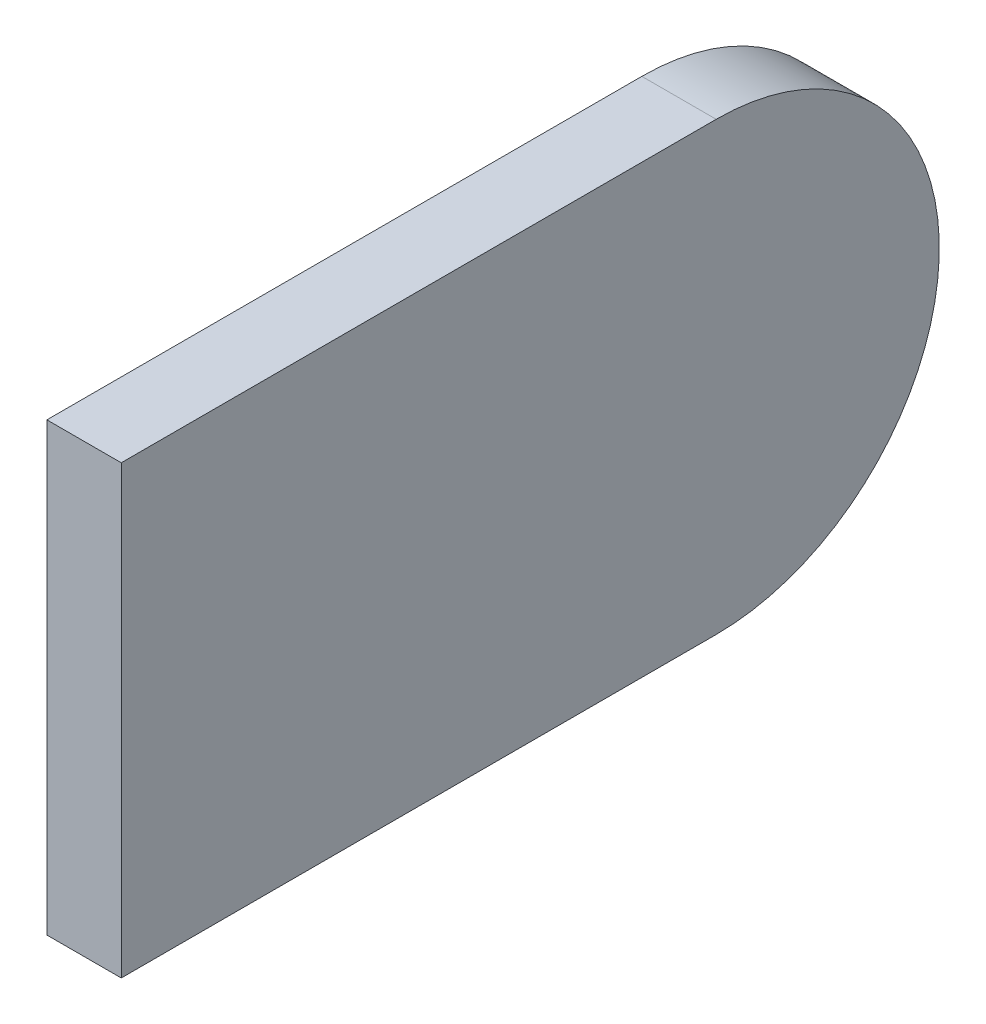
ISO-10303-21;
HEADER;
FILE_DESCRIPTION(('STEP AP214'),'2;1');
FILE_NAME('part.step','',(''),(''),'','','');
FILE_SCHEMA(('AUTOMOTIVE_DESIGN { 1 0 10303 214 1 1 1 1 }'));
ENDSEC;
DATA;
#1=APPLICATION_CONTEXT('core data for automotive mechanical design processes');
#2=APPLICATION_PROTOCOL_DEFINITION('international standard','automotive_design',2000,#1);
#3=PRODUCT_CONTEXT('',#1,'mechanical');
#4=PRODUCT('Part','Part','',(#3));
#5=PRODUCT_RELATED_PRODUCT_CATEGORY('part','',(#4));
#6=PRODUCT_DEFINITION_FORMATION('','',#4);
#7=PRODUCT_DEFINITION_CONTEXT('part definition',#1,'design');
#8=PRODUCT_DEFINITION('design','',#6,#7);
#9=PRODUCT_DEFINITION_SHAPE('','',#8);
#10=(LENGTH_UNIT() NAMED_UNIT(*) SI_UNIT(.MILLI.,.METRE.));
#11=(NAMED_UNIT(*) PLANE_ANGLE_UNIT() SI_UNIT($,.RADIAN.));
#12=(NAMED_UNIT(*) SI_UNIT($,.STERADIAN.) SOLID_ANGLE_UNIT());
#13=UNCERTAINTY_MEASURE_WITH_UNIT(LENGTH_MEASURE(1.E-05),#10,'distance_accuracy_value','');
#14=(GEOMETRIC_REPRESENTATION_CONTEXT(3) GLOBAL_UNCERTAINTY_ASSIGNED_CONTEXT((#13)) GLOBAL_UNIT_ASSIGNED_CONTEXT((#10,
#11,#12)) REPRESENTATION_CONTEXT('',''));
#15=CARTESIAN_POINT('',(0.,0.,0.));
#16=DIRECTION('',(0.,0.,1.));
#17=DIRECTION('',(1.,0.,0.));
#18=AXIS2_PLACEMENT_3D('',#15,#16,#17);
#19=CARTESIAN_POINT('',(10.,60.,0.));
#20=DIRECTION('',(0.,0.,-1.));
#21=DIRECTION('',(0.,1.,0.));
#22=AXIS2_PLACEMENT_3D('',#19,#20,#21);
#23=PLANE('',#22);
#24=DIRECTION('',(0.,-1.,0.));
#25=VECTOR('',#24,1.);
#26=CARTESIAN_POINT('',(0.,60.,0.));
#27=LINE('',#26,#25);
#28=CARTESIAN_POINT('',(0.,60.,0.));
#29=VERTEX_POINT('',#28);
#30=CARTESIAN_POINT('',(0.,0.,0.));
#31=VERTEX_POINT('',#30);
#32=EDGE_CURVE('E113',#29,#31,#27,.T.);
#33=ORIENTED_EDGE('',*,*,#32,.T.);
#34=DIRECTION('',(-1.,0.,0.));
#35=VECTOR('',#34,1.);
#36=CARTESIAN_POINT('',(10.,0.,0.));
#37=LINE('',#36,#35);
#38=CARTESIAN_POINT('',(10.,0.,0.));
#39=VERTEX_POINT('',#38);
#40=EDGE_CURVE('E11',#39,#31,#37,.T.);
#41=ORIENTED_EDGE('',*,*,#40,.F.);
#42=DIRECTION('',(0.,-1.,0.));
#43=VECTOR('',#42,1.);
#44=CARTESIAN_POINT('',(10.,60.,0.));
#45=LINE('',#44,#43);
#46=CARTESIAN_POINT('',(10.,60.,0.));
#47=VERTEX_POINT('',#46);
#48=EDGE_CURVE('E97',#47,#39,#45,.T.);
#49=ORIENTED_EDGE('',*,*,#48,.F.);
#50=DIRECTION('',(-1.,0.,0.));
#51=VECTOR('',#50,1.);
#52=CARTESIAN_POINT('',(10.,60.,0.));
#53=LINE('',#52,#51);
#54=EDGE_CURVE('E109',#47,#29,#53,.T.);
#55=ORIENTED_EDGE('',*,*,#54,.T.);
#56=EDGE_LOOP('',(#33,#41,#49,#55));
#57=FACE_BOUND('',#56,.T.);
#58=ADVANCED_FACE('F45',(#57),#23,.F.);
#59=CARTESIAN_POINT('',(10.,0.,0.));
#60=DIRECTION('',(0.,1.,0.));
#61=DIRECTION('',(0.,0.,1.));
#62=AXIS2_PLACEMENT_3D('',#59,#60,#61);
#63=PLANE('',#62);
#64=DIRECTION('',(0.,0.,-1.));
#65=VECTOR('',#64,1.);
#66=CARTESIAN_POINT('',(0.,0.,0.));
#67=LINE('',#66,#65);
#68=CARTESIAN_POINT('',(0.,0.,-80.));
#69=VERTEX_POINT('',#68);
#70=EDGE_CURVE('E102',#31,#69,#67,.T.);
#71=ORIENTED_EDGE('',*,*,#70,.T.);
#72=DIRECTION('',(-1.,0.,0.));
#73=VECTOR('',#72,1.);
#74=CARTESIAN_POINT('',(10.,0.,-80.));
#75=LINE('',#74,#73);
#76=CARTESIAN_POINT('',(10.,0.,-80.));
#77=VERTEX_POINT('',#76);
#78=EDGE_CURVE('E54',#77,#69,#75,.T.);
#79=ORIENTED_EDGE('',*,*,#78,.F.);
#80=DIRECTION('',(0.,0.,-1.));
#81=VECTOR('',#80,1.);
#82=CARTESIAN_POINT('',(10.,0.,0.));
#83=LINE('',#82,#81);
#84=EDGE_CURVE('E92',#39,#77,#83,.T.);
#85=ORIENTED_EDGE('',*,*,#84,.F.);
#86=ORIENTED_EDGE('',*,*,#40,.T.);
#87=EDGE_LOOP('',(#71,#79,#85,#86));
#88=FACE_BOUND('',#87,.T.);
#89=ADVANCED_FACE('F101',(#88),#63,.F.);
#90=CARTESIAN_POINT('',(10.,30.,-80.));
#91=DIRECTION('',(-1.,0.,0.));
#92=DIRECTION('',(0.,0.,1.));
#93=AXIS2_PLACEMENT_3D('',#90,#91,#92);
#94=CYLINDRICAL_SURFACE('',#93,30.);
#95=CARTESIAN_POINT('',(0.,30.,-80.));
#96=DIRECTION('',(1.,0.,0.));
#97=DIRECTION('',(0.,0.,-1.));
#98=AXIS2_PLACEMENT_3D('',#95,#96,#97);
#99=CIRCLE('',#98,30.);
#100=CARTESIAN_POINT('',(0.,60.,-80.));
#101=VERTEX_POINT('',#100);
#102=EDGE_CURVE('E79',#69,#101,#99,.T.);
#103=ORIENTED_EDGE('',*,*,#102,.T.);
#104=DIRECTION('',(-1.,0.,0.));
#105=VECTOR('',#104,1.);
#106=CARTESIAN_POINT('',(10.,60.,-80.));
#107=LINE('',#106,#105);
#108=CARTESIAN_POINT('',(10.,60.,-80.));
#109=VERTEX_POINT('',#108);
#110=EDGE_CURVE('E104',#109,#101,#107,.T.);
#111=ORIENTED_EDGE('',*,*,#110,.F.);
#112=CARTESIAN_POINT('',(10.,30.,-80.));
#113=DIRECTION('',(1.,0.,0.));
#114=DIRECTION('',(0.,0.,-1.));
#115=AXIS2_PLACEMENT_3D('',#112,#113,#114);
#116=CIRCLE('',#115,30.);
#117=EDGE_CURVE('E95',#77,#109,#116,.T.);
#118=ORIENTED_EDGE('',*,*,#117,.F.);
#119=ORIENTED_EDGE('',*,*,#78,.T.);
#120=EDGE_LOOP('',(#103,#111,#118,#119));
#121=FACE_BOUND('',#120,.T.);
#122=ADVANCED_FACE('F105',(#121),#94,.T.);
#123=CARTESIAN_POINT('',(10.,60.,-80.));
#124=DIRECTION('',(0.,-1.,0.));
#125=DIRECTION('',(0.,0.,-1.));
#126=AXIS2_PLACEMENT_3D('',#123,#124,#125);
#127=PLANE('',#126);
#128=DIRECTION('',(0.,0.,1.));
#129=VECTOR('',#128,1.);
#130=CARTESIAN_POINT('',(0.,60.,-80.));
#131=LINE('',#130,#129);
#132=EDGE_CURVE('E85',#101,#29,#131,.T.);
#133=ORIENTED_EDGE('',*,*,#132,.T.);
#134=ORIENTED_EDGE('',*,*,#54,.F.);
#135=DIRECTION('',(0.,0.,1.));
#136=VECTOR('',#135,1.);
#137=CARTESIAN_POINT('',(10.,60.,-80.));
#138=LINE('',#137,#136);
#139=EDGE_CURVE('E62',#109,#47,#138,.T.);
#140=ORIENTED_EDGE('',*,*,#139,.F.);
#141=ORIENTED_EDGE('',*,*,#110,.T.);
#142=EDGE_LOOP('',(#133,#134,#140,#141));
#143=FACE_BOUND('',#142,.T.);
#144=ADVANCED_FACE('F126',(#143),#127,.F.);
#145=CARTESIAN_POINT('',(10.,30.,-80.));
#146=DIRECTION('',(1.,0.,0.));
#147=DIRECTION('',(0.,0.,-1.));
#148=AXIS2_PLACEMENT_3D('',#145,#146,#147);
#149=PLANE('',#148);
#150=ORIENTED_EDGE('',*,*,#48,.T.);
#151=ORIENTED_EDGE('',*,*,#84,.T.);
#152=ORIENTED_EDGE('',*,*,#117,.T.);
#153=ORIENTED_EDGE('',*,*,#139,.T.);
#154=EDGE_LOOP('',(#150,#151,#152,#153));
#155=FACE_BOUND('',#154,.T.);
#156=ADVANCED_FACE('F93',(#155),#149,.T.);
#157=CARTESIAN_POINT('',(0.,30.,-80.));
#158=DIRECTION('',(1.,0.,0.));
#159=DIRECTION('',(0.,0.,-1.));
#160=AXIS2_PLACEMENT_3D('',#157,#158,#159);
#161=PLANE('',#160);
#162=ORIENTED_EDGE('',*,*,#32,.F.);
#163=ORIENTED_EDGE('',*,*,#132,.F.);
#164=ORIENTED_EDGE('',*,*,#102,.F.);
#165=ORIENTED_EDGE('',*,*,#70,.F.);
#166=EDGE_LOOP('',(#162,#163,#164,#165));
#167=FACE_BOUND('',#166,.T.);
#168=ADVANCED_FACE('F129',(#167),#161,.F.);
#169=CLOSED_SHELL('',(#58,#89,#122,#144,#156,#168));
#170=MANIFOLD_SOLID_BREP('B2',#169);
#171=ADVANCED_BREP_SHAPE_REPRESENTATION('',(#18,#170),#14);
#172=SHAPE_DEFINITION_REPRESENTATION(#9,#171);
ENDSEC;
END-ISO-10303-21;
